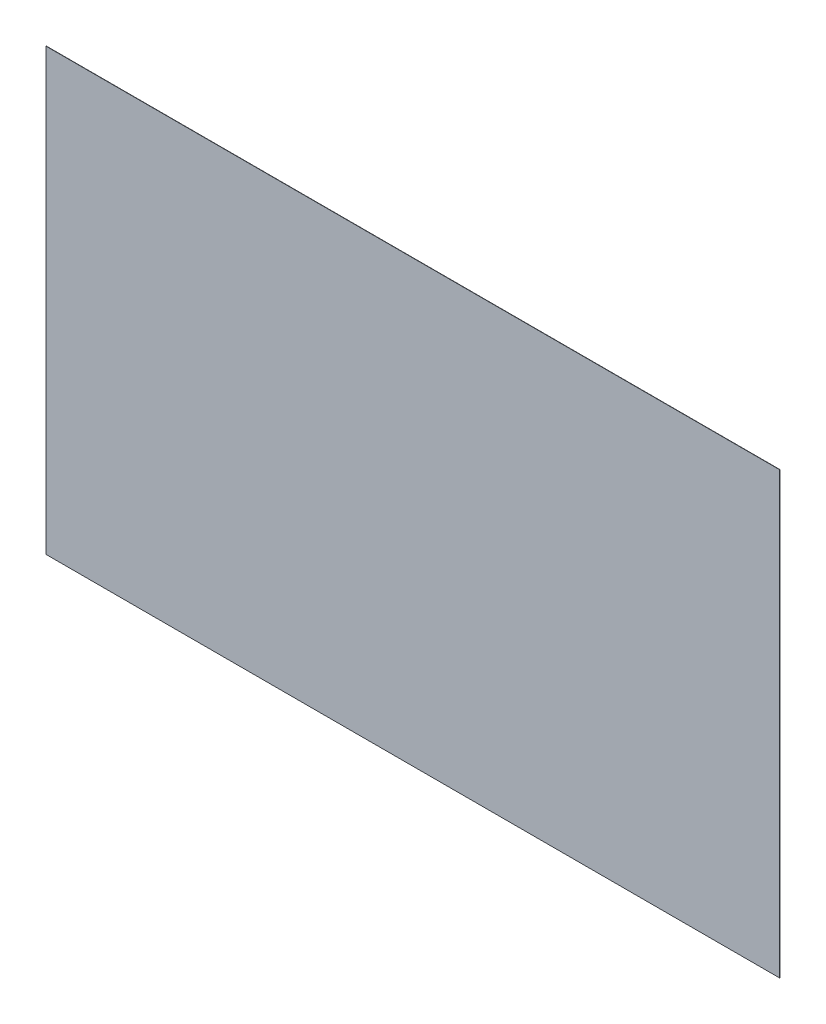
ISO-10303-21;
HEADER;
FILE_DESCRIPTION(('STEP AP214'),'2;1');
FILE_NAME('part.step','',(''),(''),'','','');
FILE_SCHEMA(('AUTOMOTIVE_DESIGN { 1 0 10303 214 1 1 1 1 }'));
ENDSEC;
DATA;
#1=APPLICATION_CONTEXT('core data for automotive mechanical design processes');
#2=APPLICATION_PROTOCOL_DEFINITION('international standard','automotive_design',2000,#1);
#3=PRODUCT_CONTEXT('',#1,'mechanical');
#4=PRODUCT('Part','Part','',(#3));
#5=PRODUCT_RELATED_PRODUCT_CATEGORY('part','',(#4));
#6=PRODUCT_DEFINITION_FORMATION('','',#4);
#7=PRODUCT_DEFINITION_CONTEXT('part definition',#1,'design');
#8=PRODUCT_DEFINITION('design','',#6,#7);
#9=PRODUCT_DEFINITION_SHAPE('','',#8);
#10=(LENGTH_UNIT() NAMED_UNIT(*) SI_UNIT(.MILLI.,.METRE.));
#11=(NAMED_UNIT(*) PLANE_ANGLE_UNIT() SI_UNIT($,.RADIAN.));
#12=(NAMED_UNIT(*) SI_UNIT($,.STERADIAN.) SOLID_ANGLE_UNIT());
#13=UNCERTAINTY_MEASURE_WITH_UNIT(LENGTH_MEASURE(1.E-05),#10,'distance_accuracy_value','');
#14=(GEOMETRIC_REPRESENTATION_CONTEXT(3) GLOBAL_UNCERTAINTY_ASSIGNED_CONTEXT((#13)) GLOBAL_UNIT_ASSIGNED_CONTEXT((#10,
#11,#12)) REPRESENTATION_CONTEXT('',''));
#15=CARTESIAN_POINT('',(0.,0.,0.));
#16=DIRECTION('',(0.,0.,1.));
#17=DIRECTION('',(1.,0.,0.));
#18=AXIS2_PLACEMENT_3D('',#15,#16,#17);
#19=CARTESIAN_POINT('',(2500.,1500.,2.));
#20=DIRECTION('',(-1.,0.,0.));
#21=DIRECTION('',(0.,-1.,0.));
#22=AXIS2_PLACEMENT_3D('',#19,#20,#21);
#23=PLANE('',#22);
#24=DIRECTION('',(0.,1.,0.));
#25=VECTOR('',#24,1.);
#26=CARTESIAN_POINT('',(2500.,1500.,0.));
#27=LINE('',#26,#25);
#28=CARTESIAN_POINT('',(2500.,-1500.,0.));
#29=VERTEX_POINT('',#28);
#30=CARTESIAN_POINT('',(2500.,1500.,0.));
#31=VERTEX_POINT('',#30);
#32=EDGE_CURVE('E98',#29,#31,#27,.T.);
#33=ORIENTED_EDGE('',*,*,#32,.T.);
#34=DIRECTION('',(0.,0.,-1.));
#35=VECTOR('',#34,1.);
#36=CARTESIAN_POINT('',(2500.,1500.,2.));
#37=LINE('',#36,#35);
#38=CARTESIAN_POINT('',(2500.,1500.,2.));
#39=VERTEX_POINT('',#38);
#40=EDGE_CURVE('E11',#39,#31,#37,.T.);
#41=ORIENTED_EDGE('',*,*,#40,.F.);
#42=DIRECTION('',(0.,1.,0.));
#43=VECTOR('',#42,1.);
#44=CARTESIAN_POINT('',(2500.,1500.,2.));
#45=LINE('',#44,#43);
#46=CARTESIAN_POINT('',(2500.,-1500.,2.));
#47=VERTEX_POINT('',#46);
#48=EDGE_CURVE('E86',#47,#39,#45,.T.);
#49=ORIENTED_EDGE('',*,*,#48,.F.);
#50=DIRECTION('',(0.,0.,-1.));
#51=VECTOR('',#50,1.);
#52=CARTESIAN_POINT('',(2500.,-1500.,2.));
#53=LINE('',#52,#51);
#54=EDGE_CURVE('E94',#47,#29,#53,.T.);
#55=ORIENTED_EDGE('',*,*,#54,.T.);
#56=EDGE_LOOP('',(#33,#41,#49,#55));
#57=FACE_BOUND('',#56,.T.);
#58=ADVANCED_FACE('F35',(#57),#23,.F.);
#59=CARTESIAN_POINT('',(-2500.,1500.,2.));
#60=DIRECTION('',(0.,-1.,0.));
#61=DIRECTION('',(0.,0.,-1.));
#62=AXIS2_PLACEMENT_3D('',#59,#60,#61);
#63=PLANE('',#62);
#64=DIRECTION('',(-1.,0.,0.));
#65=VECTOR('',#64,1.);
#66=CARTESIAN_POINT('',(-2500.,1500.,0.));
#67=LINE('',#66,#65);
#68=CARTESIAN_POINT('',(-2500.,1500.,0.));
#69=VERTEX_POINT('',#68);
#70=EDGE_CURVE('E90',#31,#69,#67,.T.);
#71=ORIENTED_EDGE('',*,*,#70,.T.);
#72=DIRECTION('',(0.,0.,-1.));
#73=VECTOR('',#72,1.);
#74=CARTESIAN_POINT('',(-2500.,1500.,2.));
#75=LINE('',#74,#73);
#76=CARTESIAN_POINT('',(-2500.,1500.,2.));
#77=VERTEX_POINT('',#76);
#78=EDGE_CURVE('E43',#77,#69,#75,.T.);
#79=ORIENTED_EDGE('',*,*,#78,.F.);
#80=DIRECTION('',(-1.,0.,0.));
#81=VECTOR('',#80,1.);
#82=CARTESIAN_POINT('',(-2500.,1500.,2.));
#83=LINE('',#82,#81);
#84=EDGE_CURVE('E81',#39,#77,#83,.T.);
#85=ORIENTED_EDGE('',*,*,#84,.F.);
#86=ORIENTED_EDGE('',*,*,#40,.T.);
#87=EDGE_LOOP('',(#71,#79,#85,#86));
#88=FACE_BOUND('',#87,.T.);
#89=ADVANCED_FACE('F89',(#88),#63,.F.);
#90=CARTESIAN_POINT('',(-2500.,1500.,2.));
#91=DIRECTION('',(1.,0.,0.));
#92=DIRECTION('',(0.,1.,0.));
#93=AXIS2_PLACEMENT_3D('',#90,#91,#92);
#94=PLANE('',#93);
#95=DIRECTION('',(0.,-1.,0.));
#96=VECTOR('',#95,1.);
#97=CARTESIAN_POINT('',(-2500.,1500.,0.));
#98=LINE('',#97,#96);
#99=CARTESIAN_POINT('',(-2500.,-1500.,0.));
#100=VERTEX_POINT('',#99);
#101=EDGE_CURVE('E68',#69,#100,#98,.T.);
#102=ORIENTED_EDGE('',*,*,#101,.T.);
#103=DIRECTION('',(0.,0.,-1.));
#104=VECTOR('',#103,1.);
#105=CARTESIAN_POINT('',(-2500.,-1500.,2.));
#106=LINE('',#105,#104);
#107=CARTESIAN_POINT('',(-2500.,-1500.,2.));
#108=VERTEX_POINT('',#107);
#109=EDGE_CURVE('E91',#108,#100,#106,.T.);
#110=ORIENTED_EDGE('',*,*,#109,.F.);
#111=DIRECTION('',(0.,-1.,0.));
#112=VECTOR('',#111,1.);
#113=CARTESIAN_POINT('',(-2500.,1500.,2.));
#114=LINE('',#113,#112);
#115=EDGE_CURVE('E84',#77,#108,#114,.T.);
#116=ORIENTED_EDGE('',*,*,#115,.F.);
#117=ORIENTED_EDGE('',*,*,#78,.T.);
#118=EDGE_LOOP('',(#102,#110,#116,#117));
#119=FACE_BOUND('',#118,.T.);
#120=ADVANCED_FACE('F92',(#119),#94,.F.);
#121=CARTESIAN_POINT('',(-2500.,-1500.,2.));
#122=DIRECTION('',(0.,1.,0.));
#123=DIRECTION('',(0.,0.,1.));
#124=AXIS2_PLACEMENT_3D('',#121,#122,#123);
#125=PLANE('',#124);
#126=DIRECTION('',(1.,0.,0.));
#127=VECTOR('',#126,1.);
#128=CARTESIAN_POINT('',(-2500.,-1500.,0.));
#129=LINE('',#128,#127);
#130=EDGE_CURVE('E74',#100,#29,#129,.T.);
#131=ORIENTED_EDGE('',*,*,#130,.T.);
#132=ORIENTED_EDGE('',*,*,#54,.F.);
#133=DIRECTION('',(1.,0.,0.));
#134=VECTOR('',#133,1.);
#135=CARTESIAN_POINT('',(-2500.,-1500.,2.));
#136=LINE('',#135,#134);
#137=EDGE_CURVE('E51',#108,#47,#136,.T.);
#138=ORIENTED_EDGE('',*,*,#137,.F.);
#139=ORIENTED_EDGE('',*,*,#109,.T.);
#140=EDGE_LOOP('',(#131,#132,#138,#139));
#141=FACE_BOUND('',#140,.T.);
#142=ADVANCED_FACE('F105',(#141),#125,.F.);
#143=CARTESIAN_POINT('',(0.,0.,2.));
#144=DIRECTION('',(0.,0.,1.));
#145=DIRECTION('',(1.,0.,0.));
#146=AXIS2_PLACEMENT_3D('',#143,#144,#145);
#147=PLANE('',#146);
#148=ORIENTED_EDGE('',*,*,#48,.T.);
#149=ORIENTED_EDGE('',*,*,#84,.T.);
#150=ORIENTED_EDGE('',*,*,#115,.T.);
#151=ORIENTED_EDGE('',*,*,#137,.T.);
#152=EDGE_LOOP('',(#148,#149,#150,#151));
#153=FACE_BOUND('',#152,.T.);
#154=ADVANCED_FACE('F82',(#153),#147,.T.);
#155=CARTESIAN_POINT('',(0.,0.,0.));
#156=DIRECTION('',(0.,0.,1.));
#157=DIRECTION('',(1.,0.,0.));
#158=AXIS2_PLACEMENT_3D('',#155,#156,#157);
#159=PLANE('',#158);
#160=ORIENTED_EDGE('',*,*,#32,.F.);
#161=ORIENTED_EDGE('',*,*,#130,.F.);
#162=ORIENTED_EDGE('',*,*,#101,.F.);
#163=ORIENTED_EDGE('',*,*,#70,.F.);
#164=EDGE_LOOP('',(#160,#161,#162,#163));
#165=FACE_BOUND('',#164,.T.);
#166=ADVANCED_FACE('F108',(#165),#159,.F.);
#167=CLOSED_SHELL('',(#58,#89,#120,#142,#154,#166));
#168=MANIFOLD_SOLID_BREP('B2',#167);
#169=ADVANCED_BREP_SHAPE_REPRESENTATION('',(#18,#168),#14);
#170=SHAPE_DEFINITION_REPRESENTATION(#9,#169);
ENDSEC;
END-ISO-10303-21;
